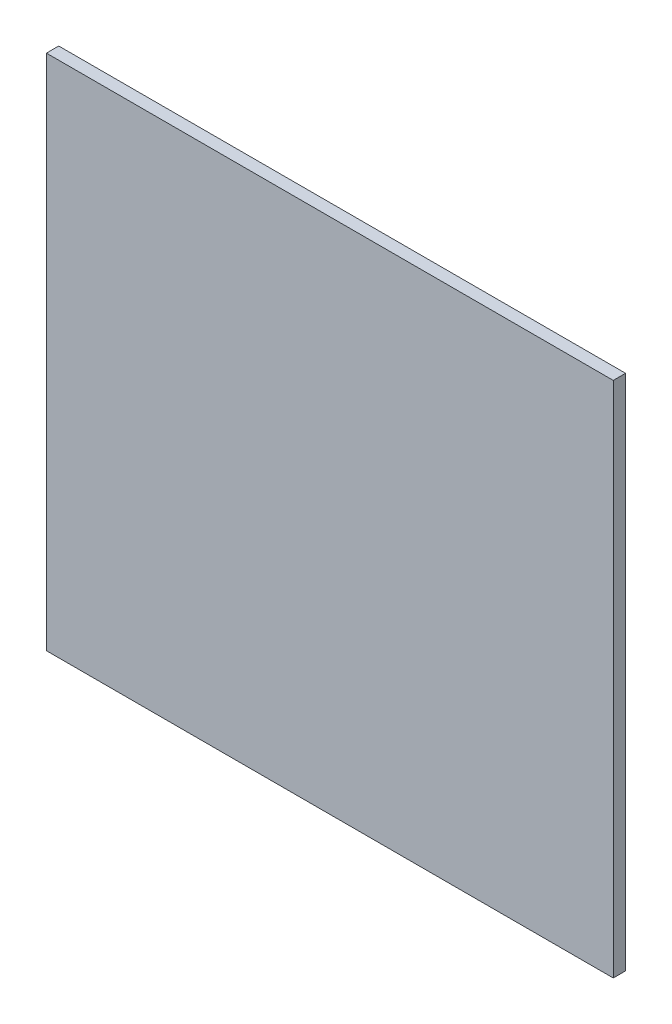
ISO-10303-21;
HEADER;
FILE_DESCRIPTION(('STEP AP214'),'2;1');
FILE_NAME('part.step','',(''),(''),'','','');
FILE_SCHEMA(('AUTOMOTIVE_DESIGN { 1 0 10303 214 1 1 1 1 }'));
ENDSEC;
DATA;
#1=APPLICATION_CONTEXT('core data for automotive mechanical design processes');
#2=APPLICATION_PROTOCOL_DEFINITION('international standard','automotive_design',2000,#1);
#3=PRODUCT_CONTEXT('',#1,'mechanical');
#4=PRODUCT('Part','Part','',(#3));
#5=PRODUCT_RELATED_PRODUCT_CATEGORY('part','',(#4));
#6=PRODUCT_DEFINITION_FORMATION('','',#4);
#7=PRODUCT_DEFINITION_CONTEXT('part definition',#1,'design');
#8=PRODUCT_DEFINITION('design','',#6,#7);
#9=PRODUCT_DEFINITION_SHAPE('','',#8);
#10=(LENGTH_UNIT() NAMED_UNIT(*) SI_UNIT(.MILLI.,.METRE.));
#11=(NAMED_UNIT(*) PLANE_ANGLE_UNIT() SI_UNIT($,.RADIAN.));
#12=(NAMED_UNIT(*) SI_UNIT($,.STERADIAN.) SOLID_ANGLE_UNIT());
#13=UNCERTAINTY_MEASURE_WITH_UNIT(LENGTH_MEASURE(1.E-05),#10,'distance_accuracy_value','');
#14=(GEOMETRIC_REPRESENTATION_CONTEXT(3) GLOBAL_UNCERTAINTY_ASSIGNED_CONTEXT((#13)) GLOBAL_UNIT_ASSIGNED_CONTEXT((#10,
#11,#12)) REPRESENTATION_CONTEXT('',''));
#15=CARTESIAN_POINT('',(0.,0.,0.));
#16=DIRECTION('',(0.,0.,1.));
#17=DIRECTION('',(1.,0.,0.));
#18=AXIS2_PLACEMENT_3D('',#15,#16,#17);
#19=CARTESIAN_POINT('',(-23.,-21.,1.));
#20=DIRECTION('',(1.,0.,0.));
#21=DIRECTION('',(0.,0.,-1.));
#22=AXIS2_PLACEMENT_3D('',#19,#20,#21);
#23=PLANE('',#22);
#24=DIRECTION('',(0.,-1.,0.));
#25=VECTOR('',#24,1.);
#26=CARTESIAN_POINT('',(-23.,-21.,0.));
#27=LINE('',#26,#25);
#28=CARTESIAN_POINT('',(-23.,21.,0.));
#29=VERTEX_POINT('',#28);
#30=CARTESIAN_POINT('',(-23.,-21.,0.));
#31=VERTEX_POINT('',#30);
#32=EDGE_CURVE('E96',#29,#31,#27,.T.);
#33=ORIENTED_EDGE('',*,*,#32,.T.);
#34=DIRECTION('',(0.,0.,-1.));
#35=VECTOR('',#34,1.);
#36=CARTESIAN_POINT('',(-23.,-21.,1.));
#37=LINE('',#36,#35);
#38=CARTESIAN_POINT('',(-23.,-21.,1.));
#39=VERTEX_POINT('',#38);
#40=EDGE_CURVE('E11',#39,#31,#37,.T.);
#41=ORIENTED_EDGE('',*,*,#40,.F.);
#42=DIRECTION('',(0.,-1.,0.));
#43=VECTOR('',#42,1.);
#44=CARTESIAN_POINT('',(-23.,-21.,1.));
#45=LINE('',#44,#43);
#46=CARTESIAN_POINT('',(-23.,21.,1.));
#47=VERTEX_POINT('',#46);
#48=EDGE_CURVE('E84',#47,#39,#45,.T.);
#49=ORIENTED_EDGE('',*,*,#48,.F.);
#50=DIRECTION('',(0.,0.,-1.));
#51=VECTOR('',#50,1.);
#52=CARTESIAN_POINT('',(-23.,21.,1.));
#53=LINE('',#52,#51);
#54=EDGE_CURVE('E92',#47,#29,#53,.T.);
#55=ORIENTED_EDGE('',*,*,#54,.T.);
#56=EDGE_LOOP('',(#33,#41,#49,#55));
#57=FACE_BOUND('',#56,.T.);
#58=ADVANCED_FACE('F33',(#57),#23,.F.);
#59=CARTESIAN_POINT('',(23.,-21.,1.));
#60=DIRECTION('',(0.,1.,0.));
#61=DIRECTION('',(-1.,0.,0.));
#62=AXIS2_PLACEMENT_3D('',#59,#60,#61);
#63=PLANE('',#62);
#64=DIRECTION('',(1.,0.,0.));
#65=VECTOR('',#64,1.);
#66=CARTESIAN_POINT('',(23.,-21.,0.));
#67=LINE('',#66,#65);
#68=CARTESIAN_POINT('',(23.,-21.,0.));
#69=VERTEX_POINT('',#68);
#70=EDGE_CURVE('E88',#31,#69,#67,.T.);
#71=ORIENTED_EDGE('',*,*,#70,.T.);
#72=DIRECTION('',(0.,0.,-1.));
#73=VECTOR('',#72,1.);
#74=CARTESIAN_POINT('',(23.,-21.,1.));
#75=LINE('',#74,#73);
#76=CARTESIAN_POINT('',(23.,-21.,1.));
#77=VERTEX_POINT('',#76);
#78=EDGE_CURVE('E41',#77,#69,#75,.T.);
#79=ORIENTED_EDGE('',*,*,#78,.F.);
#80=DIRECTION('',(1.,0.,0.));
#81=VECTOR('',#80,1.);
#82=CARTESIAN_POINT('',(23.,-21.,1.));
#83=LINE('',#82,#81);
#84=EDGE_CURVE('E79',#39,#77,#83,.T.);
#85=ORIENTED_EDGE('',*,*,#84,.F.);
#86=ORIENTED_EDGE('',*,*,#40,.T.);
#87=EDGE_LOOP('',(#71,#79,#85,#86));
#88=FACE_BOUND('',#87,.T.);
#89=ADVANCED_FACE('F87',(#88),#63,.F.);
#90=CARTESIAN_POINT('',(23.,-21.,1.));
#91=DIRECTION('',(-1.,0.,0.));
#92=DIRECTION('',(0.,0.,1.));
#93=AXIS2_PLACEMENT_3D('',#90,#91,#92);
#94=PLANE('',#93);
#95=DIRECTION('',(0.,1.,0.));
#96=VECTOR('',#95,1.);
#97=CARTESIAN_POINT('',(23.,-21.,0.));
#98=LINE('',#97,#96);
#99=CARTESIAN_POINT('',(23.,21.,0.));
#100=VERTEX_POINT('',#99);
#101=EDGE_CURVE('E66',#69,#100,#98,.T.);
#102=ORIENTED_EDGE('',*,*,#101,.T.);
#103=DIRECTION('',(0.,0.,-1.));
#104=VECTOR('',#103,1.);
#105=CARTESIAN_POINT('',(23.,21.,1.));
#106=LINE('',#105,#104);
#107=CARTESIAN_POINT('',(23.,21.,1.));
#108=VERTEX_POINT('',#107);
#109=EDGE_CURVE('E89',#108,#100,#106,.T.);
#110=ORIENTED_EDGE('',*,*,#109,.F.);
#111=DIRECTION('',(0.,1.,0.));
#112=VECTOR('',#111,1.);
#113=CARTESIAN_POINT('',(23.,-21.,1.));
#114=LINE('',#113,#112);
#115=EDGE_CURVE('E82',#77,#108,#114,.T.);
#116=ORIENTED_EDGE('',*,*,#115,.F.);
#117=ORIENTED_EDGE('',*,*,#78,.T.);
#118=EDGE_LOOP('',(#102,#110,#116,#117));
#119=FACE_BOUND('',#118,.T.);
#120=ADVANCED_FACE('F90',(#119),#94,.F.);
#121=CARTESIAN_POINT('',(23.,21.,1.));
#122=DIRECTION('',(0.,-1.,0.));
#123=DIRECTION('',(0.,0.,-1.));
#124=AXIS2_PLACEMENT_3D('',#121,#122,#123);
#125=PLANE('',#124);
#126=DIRECTION('',(-1.,0.,0.));
#127=VECTOR('',#126,1.);
#128=CARTESIAN_POINT('',(23.,21.,0.));
#129=LINE('',#128,#127);
#130=EDGE_CURVE('E72',#100,#29,#129,.T.);
#131=ORIENTED_EDGE('',*,*,#130,.T.);
#132=ORIENTED_EDGE('',*,*,#54,.F.);
#133=DIRECTION('',(-1.,0.,0.));
#134=VECTOR('',#133,1.);
#135=CARTESIAN_POINT('',(23.,21.,1.));
#136=LINE('',#135,#134);
#137=EDGE_CURVE('E49',#108,#47,#136,.T.);
#138=ORIENTED_EDGE('',*,*,#137,.F.);
#139=ORIENTED_EDGE('',*,*,#109,.T.);
#140=EDGE_LOOP('',(#131,#132,#138,#139));
#141=FACE_BOUND('',#140,.T.);
#142=ADVANCED_FACE('F103',(#141),#125,.F.);
#143=CARTESIAN_POINT('',(0.,0.,1.));
#144=DIRECTION('',(0.,0.,1.));
#145=DIRECTION('',(1.,0.,0.));
#146=AXIS2_PLACEMENT_3D('',#143,#144,#145);
#147=PLANE('',#146);
#148=ORIENTED_EDGE('',*,*,#48,.T.);
#149=ORIENTED_EDGE('',*,*,#84,.T.);
#150=ORIENTED_EDGE('',*,*,#115,.T.);
#151=ORIENTED_EDGE('',*,*,#137,.T.);
#152=EDGE_LOOP('',(#148,#149,#150,#151));
#153=FACE_BOUND('',#152,.T.);
#154=ADVANCED_FACE('F80',(#153),#147,.T.);
#155=CARTESIAN_POINT('',(0.,0.,0.));
#156=DIRECTION('',(0.,0.,1.));
#157=DIRECTION('',(1.,0.,0.));
#158=AXIS2_PLACEMENT_3D('',#155,#156,#157);
#159=PLANE('',#158);
#160=ORIENTED_EDGE('',*,*,#32,.F.);
#161=ORIENTED_EDGE('',*,*,#130,.F.);
#162=ORIENTED_EDGE('',*,*,#101,.F.);
#163=ORIENTED_EDGE('',*,*,#70,.F.);
#164=EDGE_LOOP('',(#160,#161,#162,#163));
#165=FACE_BOUND('',#164,.T.);
#166=ADVANCED_FACE('F106',(#165),#159,.F.);
#167=CLOSED_SHELL('',(#58,#89,#120,#142,#154,#166));
#168=MANIFOLD_SOLID_BREP('B2',#167);
#169=ADVANCED_BREP_SHAPE_REPRESENTATION('',(#18,#168),#14);
#170=SHAPE_DEFINITION_REPRESENTATION(#9,#169);
ENDSEC;
END-ISO-10303-21;
